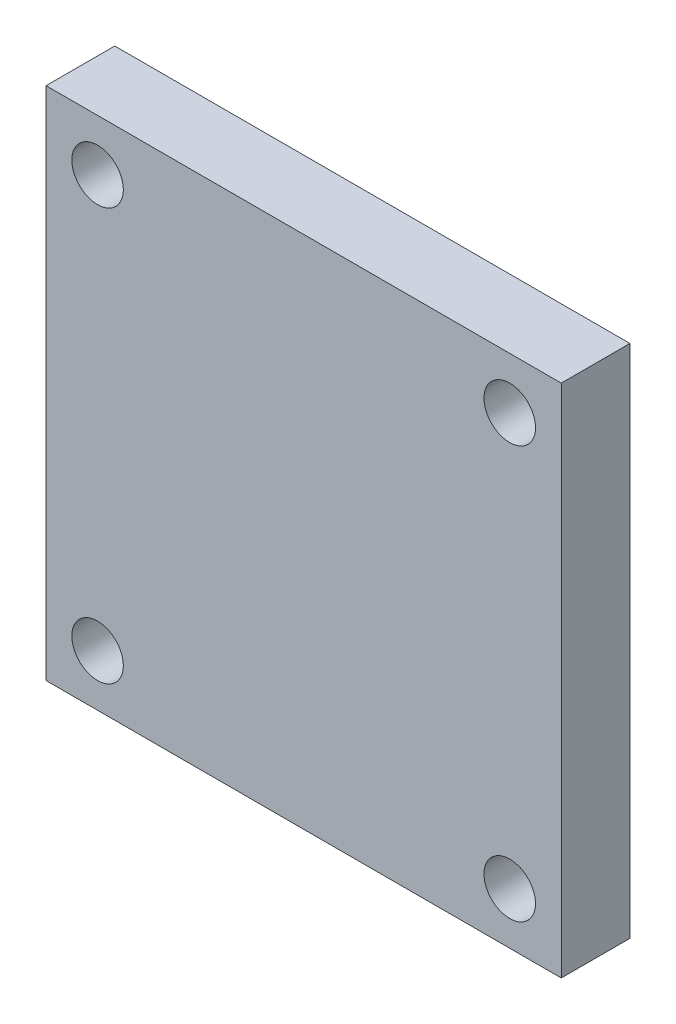
ISO-10303-21;
HEADER;
FILE_DESCRIPTION(('STEP AP214'),'2;1');
FILE_NAME('part.step','',(''),(''),'','','');
FILE_SCHEMA(('AUTOMOTIVE_DESIGN { 1 0 10303 214 1 1 1 1 }'));
ENDSEC;
DATA;
#1=APPLICATION_CONTEXT('core data for automotive mechanical design processes');
#2=APPLICATION_PROTOCOL_DEFINITION('international standard','automotive_design',2000,#1);
#3=PRODUCT_CONTEXT('',#1,'mechanical');
#4=PRODUCT('Part','Part','',(#3));
#5=PRODUCT_RELATED_PRODUCT_CATEGORY('part','',(#4));
#6=PRODUCT_DEFINITION_FORMATION('','',#4);
#7=PRODUCT_DEFINITION_CONTEXT('part definition',#1,'design');
#8=PRODUCT_DEFINITION('design','',#6,#7);
#9=PRODUCT_DEFINITION_SHAPE('','',#8);
#10=(LENGTH_UNIT() NAMED_UNIT(*) SI_UNIT(.MILLI.,.METRE.));
#11=(NAMED_UNIT(*) PLANE_ANGLE_UNIT() SI_UNIT($,.RADIAN.));
#12=(NAMED_UNIT(*) SI_UNIT($,.STERADIAN.) SOLID_ANGLE_UNIT());
#13=UNCERTAINTY_MEASURE_WITH_UNIT(LENGTH_MEASURE(1.E-05),#10,'distance_accuracy_value','');
#14=(GEOMETRIC_REPRESENTATION_CONTEXT(3) GLOBAL_UNCERTAINTY_ASSIGNED_CONTEXT((#13)) GLOBAL_UNIT_ASSIGNED_CONTEXT((#10,
#11,#12)) REPRESENTATION_CONTEXT('',''));
#15=CARTESIAN_POINT('',(0.,0.,0.));
#16=DIRECTION('',(0.,0.,1.));
#17=DIRECTION('',(1.,0.,0.));
#18=AXIS2_PLACEMENT_3D('',#15,#16,#17);
#19=CARTESIAN_POINT('',(0.,0.,4.));
#20=DIRECTION('',(0.,0.,1.));
#21=DIRECTION('',(1.,0.,0.));
#22=AXIS2_PLACEMENT_3D('',#19,#20,#21);
#23=PLANE('',#22);
#24=CARTESIAN_POINT('',(27.,-3.,4.));
#25=DIRECTION('',(0.,0.,1.));
#26=DIRECTION('',(1.,0.,0.));
#27=AXIS2_PLACEMENT_3D('',#24,#25,#26);
#28=CIRCLE('',#27,1.5);
#29=CARTESIAN_POINT('',(28.5,-3.,4.));
#30=VERTEX_POINT('',#29);
#31=EDGE_CURVE('E121',#30,#30,#28,.T.);
#32=ORIENTED_EDGE('',*,*,#31,.F.);
#33=EDGE_LOOP('',(#32));
#34=FACE_BOUND('',#33,.T.);
#35=CARTESIAN_POINT('',(3.,-3.,4.));
#36=DIRECTION('',(0.,0.,1.));
#37=DIRECTION('',(1.,0.,0.));
#38=AXIS2_PLACEMENT_3D('',#35,#36,#37);
#39=CIRCLE('',#38,1.5);
#40=CARTESIAN_POINT('',(4.50000000000001,-3.,4.));
#41=VERTEX_POINT('',#40);
#42=EDGE_CURVE('E100',#41,#41,#39,.T.);
#43=ORIENTED_EDGE('',*,*,#42,.F.);
#44=EDGE_LOOP('',(#43));
#45=FACE_BOUND('',#44,.T.);
#46=DIRECTION('',(0.,1.,0.));
#47=VECTOR('',#46,1.);
#48=CARTESIAN_POINT('',(30.,0.,4.));
#49=LINE('',#48,#47);
#50=CARTESIAN_POINT('',(30.,-30.,4.));
#51=VERTEX_POINT('',#50);
#52=CARTESIAN_POINT('',(30.,0.,4.));
#53=VERTEX_POINT('',#52);
#54=EDGE_CURVE('E85',#51,#53,#49,.T.);
#55=ORIENTED_EDGE('',*,*,#54,.T.);
#56=DIRECTION('',(-1.,0.,0.));
#57=VECTOR('',#56,1.);
#58=CARTESIAN_POINT('',(0.,0.,4.));
#59=LINE('',#58,#57);
#60=CARTESIAN_POINT('',(0.,0.,4.));
#61=VERTEX_POINT('',#60);
#62=EDGE_CURVE('E80',#53,#61,#59,.T.);
#63=ORIENTED_EDGE('',*,*,#62,.T.);
#64=DIRECTION('',(0.,-1.,0.));
#65=VECTOR('',#64,1.);
#66=CARTESIAN_POINT('',(0.,0.,4.));
#67=LINE('',#66,#65);
#68=CARTESIAN_POINT('',(0.,-30.,4.));
#69=VERTEX_POINT('',#68);
#70=EDGE_CURVE('E83',#61,#69,#67,.T.);
#71=ORIENTED_EDGE('',*,*,#70,.T.);
#72=DIRECTION('',(1.,0.,0.));
#73=VECTOR('',#72,1.);
#74=CARTESIAN_POINT('',(0.,-30.,4.));
#75=LINE('',#74,#73);
#76=EDGE_CURVE('E50',#69,#51,#75,.T.);
#77=ORIENTED_EDGE('',*,*,#76,.T.);
#78=EDGE_LOOP('',(#55,#63,#71,#77));
#79=FACE_BOUND('',#78,.T.);
#80=CARTESIAN_POINT('',(3.,-27.,4.));
#81=DIRECTION('',(0.,0.,1.));
#82=DIRECTION('',(1.,0.,0.));
#83=AXIS2_PLACEMENT_3D('',#80,#81,#82);
#84=CIRCLE('',#83,1.5);
#85=CARTESIAN_POINT('',(4.50000000000001,-27.,4.));
#86=VERTEX_POINT('',#85);
#87=EDGE_CURVE('E115',#86,#86,#84,.T.);
#88=ORIENTED_EDGE('',*,*,#87,.F.);
#89=EDGE_LOOP('',(#88));
#90=FACE_BOUND('',#89,.T.);
#91=CARTESIAN_POINT('',(27.,-27.,4.));
#92=DIRECTION('',(0.,0.,1.));
#93=DIRECTION('',(1.,0.,0.));
#94=AXIS2_PLACEMENT_3D('',#91,#92,#93);
#95=CIRCLE('',#94,1.5);
#96=CARTESIAN_POINT('',(28.5,-27.,4.));
#97=VERTEX_POINT('',#96);
#98=EDGE_CURVE('E127',#97,#97,#95,.T.);
#99=ORIENTED_EDGE('',*,*,#98,.F.);
#100=EDGE_LOOP('',(#99));
#101=FACE_BOUND('',#100,.T.);
#102=ADVANCED_FACE('F33',(#34,#45,#79,#90,#101),#23,.T.);
#103=CARTESIAN_POINT('',(0.,0.,0.));
#104=DIRECTION('',(0.,0.,1.));
#105=DIRECTION('',(1.,0.,0.));
#106=AXIS2_PLACEMENT_3D('',#103,#104,#105);
#107=PLANE('',#106);
#108=DIRECTION('',(0.,1.,0.));
#109=VECTOR('',#108,1.);
#110=CARTESIAN_POINT('',(30.,0.,0.));
#111=LINE('',#110,#109);
#112=CARTESIAN_POINT('',(30.,-30.,0.));
#113=VERTEX_POINT('',#112);
#114=CARTESIAN_POINT('',(30.,0.,0.));
#115=VERTEX_POINT('',#114);
#116=EDGE_CURVE('E97',#113,#115,#111,.T.);
#117=ORIENTED_EDGE('',*,*,#116,.F.);
#118=DIRECTION('',(1.,0.,0.));
#119=VECTOR('',#118,1.);
#120=CARTESIAN_POINT('',(0.,-30.,0.));
#121=LINE('',#120,#119);
#122=CARTESIAN_POINT('',(0.,-30.,0.));
#123=VERTEX_POINT('',#122);
#124=EDGE_CURVE('E73',#123,#113,#121,.T.);
#125=ORIENTED_EDGE('',*,*,#124,.F.);
#126=DIRECTION('',(0.,-1.,0.));
#127=VECTOR('',#126,1.);
#128=CARTESIAN_POINT('',(0.,0.,0.));
#129=LINE('',#128,#127);
#130=CARTESIAN_POINT('',(0.,0.,0.));
#131=VERTEX_POINT('',#130);
#132=EDGE_CURVE('E67',#131,#123,#129,.T.);
#133=ORIENTED_EDGE('',*,*,#132,.F.);
#134=DIRECTION('',(-1.,0.,0.));
#135=VECTOR('',#134,1.);
#136=CARTESIAN_POINT('',(0.,0.,0.));
#137=LINE('',#136,#135);
#138=EDGE_CURVE('E89',#115,#131,#137,.T.);
#139=ORIENTED_EDGE('',*,*,#138,.F.);
#140=EDGE_LOOP('',(#117,#125,#133,#139));
#141=FACE_BOUND('',#140,.T.);
#142=CARTESIAN_POINT('',(3.,-3.,0.));
#143=DIRECTION('',(0.,0.,1.));
#144=DIRECTION('',(1.,0.,0.));
#145=AXIS2_PLACEMENT_3D('',#142,#143,#144);
#146=CIRCLE('',#145,1.5);
#147=CARTESIAN_POINT('',(4.50000000000001,-3.,0.));
#148=VERTEX_POINT('',#147);
#149=EDGE_CURVE('E112',#148,#148,#146,.T.);
#150=ORIENTED_EDGE('',*,*,#149,.T.);
#151=EDGE_LOOP('',(#150));
#152=FACE_BOUND('',#151,.T.);
#153=CARTESIAN_POINT('',(3.,-27.,0.));
#154=DIRECTION('',(0.,0.,1.));
#155=DIRECTION('',(1.,0.,0.));
#156=AXIS2_PLACEMENT_3D('',#153,#154,#155);
#157=CIRCLE('',#156,1.5);
#158=CARTESIAN_POINT('',(4.50000000000001,-27.,0.));
#159=VERTEX_POINT('',#158);
#160=EDGE_CURVE('E118',#159,#159,#157,.T.);
#161=ORIENTED_EDGE('',*,*,#160,.T.);
#162=EDGE_LOOP('',(#161));
#163=FACE_BOUND('',#162,.T.);
#164=CARTESIAN_POINT('',(27.,-3.,0.));
#165=DIRECTION('',(0.,0.,1.));
#166=DIRECTION('',(1.,0.,0.));
#167=AXIS2_PLACEMENT_3D('',#164,#165,#166);
#168=CIRCLE('',#167,1.5);
#169=CARTESIAN_POINT('',(28.5,-3.,0.));
#170=VERTEX_POINT('',#169);
#171=EDGE_CURVE('E124',#170,#170,#168,.T.);
#172=ORIENTED_EDGE('',*,*,#171,.T.);
#173=EDGE_LOOP('',(#172));
#174=FACE_BOUND('',#173,.T.);
#175=CARTESIAN_POINT('',(27.,-27.,0.));
#176=DIRECTION('',(0.,0.,1.));
#177=DIRECTION('',(1.,0.,0.));
#178=AXIS2_PLACEMENT_3D('',#175,#176,#177);
#179=CIRCLE('',#178,1.5);
#180=CARTESIAN_POINT('',(28.5,-27.,0.));
#181=VERTEX_POINT('',#180);
#182=EDGE_CURVE('E130',#181,#181,#179,.T.);
#183=ORIENTED_EDGE('',*,*,#182,.T.);
#184=EDGE_LOOP('',(#183));
#185=FACE_BOUND('',#184,.T.);
#186=ADVANCED_FACE('F108',(#141,#152,#163,#174,#185),#107,.F.);
#187=CARTESIAN_POINT('',(30.,0.,4.));
#188=DIRECTION('',(-1.,0.,0.));
#189=DIRECTION('',(0.,0.,1.));
#190=AXIS2_PLACEMENT_3D('',#187,#188,#189);
#191=PLANE('',#190);
#192=ORIENTED_EDGE('',*,*,#116,.T.);
#193=DIRECTION('',(0.,0.,-1.));
#194=VECTOR('',#193,1.);
#195=CARTESIAN_POINT('',(30.,0.,4.));
#196=LINE('',#195,#194);
#197=EDGE_CURVE('E11',#53,#115,#196,.T.);
#198=ORIENTED_EDGE('',*,*,#197,.F.);
#199=ORIENTED_EDGE('',*,*,#54,.F.);
#200=DIRECTION('',(0.,0.,-1.));
#201=VECTOR('',#200,1.);
#202=CARTESIAN_POINT('',(30.,-30.,4.));
#203=LINE('',#202,#201);
#204=EDGE_CURVE('E93',#51,#113,#203,.T.);
#205=ORIENTED_EDGE('',*,*,#204,.T.);
#206=EDGE_LOOP('',(#192,#198,#199,#205));
#207=FACE_BOUND('',#206,.T.);
#208=ADVANCED_FACE('F35',(#207),#191,.F.);
#209=CARTESIAN_POINT('',(0.,0.,4.));
#210=DIRECTION('',(0.,-1.,0.));
#211=DIRECTION('',(0.,0.,-1.));
#212=AXIS2_PLACEMENT_3D('',#209,#210,#211);
#213=PLANE('',#212);
#214=ORIENTED_EDGE('',*,*,#138,.T.);
#215=DIRECTION('',(0.,0.,-1.));
#216=VECTOR('',#215,1.);
#217=CARTESIAN_POINT('',(0.,0.,4.));
#218=LINE('',#217,#216);
#219=EDGE_CURVE('E42',#61,#131,#218,.T.);
#220=ORIENTED_EDGE('',*,*,#219,.F.);
#221=ORIENTED_EDGE('',*,*,#62,.F.);
#222=ORIENTED_EDGE('',*,*,#197,.T.);
#223=EDGE_LOOP('',(#214,#220,#221,#222));
#224=FACE_BOUND('',#223,.T.);
#225=ADVANCED_FACE('F88',(#224),#213,.F.);
#226=CARTESIAN_POINT('',(0.,0.,4.));
#227=DIRECTION('',(1.,0.,0.));
#228=DIRECTION('',(0.,1.,0.));
#229=AXIS2_PLACEMENT_3D('',#226,#227,#228);
#230=PLANE('',#229);
#231=ORIENTED_EDGE('',*,*,#132,.T.);
#232=DIRECTION('',(0.,0.,-1.));
#233=VECTOR('',#232,1.);
#234=CARTESIAN_POINT('',(0.,-30.,4.));
#235=LINE('',#234,#233);
#236=EDGE_CURVE('E90',#69,#123,#235,.T.);
#237=ORIENTED_EDGE('',*,*,#236,.F.);
#238=ORIENTED_EDGE('',*,*,#70,.F.);
#239=ORIENTED_EDGE('',*,*,#219,.T.);
#240=EDGE_LOOP('',(#231,#237,#238,#239));
#241=FACE_BOUND('',#240,.T.);
#242=ADVANCED_FACE('F91',(#241),#230,.F.);
#243=CARTESIAN_POINT('',(0.,-30.,4.));
#244=DIRECTION('',(0.,1.,0.));
#245=DIRECTION('',(0.,0.,1.));
#246=AXIS2_PLACEMENT_3D('',#243,#244,#245);
#247=PLANE('',#246);
#248=ORIENTED_EDGE('',*,*,#124,.T.);
#249=ORIENTED_EDGE('',*,*,#204,.F.);
#250=ORIENTED_EDGE('',*,*,#76,.F.);
#251=ORIENTED_EDGE('',*,*,#236,.T.);
#252=EDGE_LOOP('',(#248,#249,#250,#251));
#253=FACE_BOUND('',#252,.T.);
#254=ADVANCED_FACE('F105',(#253),#247,.F.);
#255=CARTESIAN_POINT('',(3.,-3.,4.));
#256=DIRECTION('',(0.,0.,-1.));
#257=DIRECTION('',(-1.,0.,0.));
#258=AXIS2_PLACEMENT_3D('',#255,#256,#257);
#259=CYLINDRICAL_SURFACE('',#258,1.5);
#260=ORIENTED_EDGE('',*,*,#42,.T.);
#261=EDGE_LOOP('',(#260));
#262=FACE_BOUND('',#261,.T.);
#263=ORIENTED_EDGE('',*,*,#149,.F.);
#264=EDGE_LOOP('',(#263));
#265=FACE_BOUND('',#264,.T.);
#266=ADVANCED_FACE('F149',(#262,#265),#259,.F.);
#267=CARTESIAN_POINT('',(3.,-27.,4.));
#268=DIRECTION('',(0.,0.,-1.));
#269=DIRECTION('',(-1.,0.,0.));
#270=AXIS2_PLACEMENT_3D('',#267,#268,#269);
#271=CYLINDRICAL_SURFACE('',#270,1.5);
#272=ORIENTED_EDGE('',*,*,#87,.T.);
#273=EDGE_LOOP('',(#272));
#274=FACE_BOUND('',#273,.T.);
#275=ORIENTED_EDGE('',*,*,#160,.F.);
#276=EDGE_LOOP('',(#275));
#277=FACE_BOUND('',#276,.T.);
#278=ADVANCED_FACE('F195',(#274,#277),#271,.F.);
#279=CARTESIAN_POINT('',(27.,-3.,4.));
#280=DIRECTION('',(0.,0.,-1.));
#281=DIRECTION('',(-1.,0.,0.));
#282=AXIS2_PLACEMENT_3D('',#279,#280,#281);
#283=CYLINDRICAL_SURFACE('',#282,1.5);
#284=ORIENTED_EDGE('',*,*,#31,.T.);
#285=EDGE_LOOP('',(#284));
#286=FACE_BOUND('',#285,.T.);
#287=ORIENTED_EDGE('',*,*,#171,.F.);
#288=EDGE_LOOP('',(#287));
#289=FACE_BOUND('',#288,.T.);
#290=ADVANCED_FACE('F203',(#286,#289),#283,.F.);
#291=CARTESIAN_POINT('',(27.,-27.,4.));
#292=DIRECTION('',(0.,0.,-1.));
#293=DIRECTION('',(-1.,0.,0.));
#294=AXIS2_PLACEMENT_3D('',#291,#292,#293);
#295=CYLINDRICAL_SURFACE('',#294,1.5);
#296=ORIENTED_EDGE('',*,*,#98,.T.);
#297=EDGE_LOOP('',(#296));
#298=FACE_BOUND('',#297,.T.);
#299=ORIENTED_EDGE('',*,*,#182,.F.);
#300=EDGE_LOOP('',(#299));
#301=FACE_BOUND('',#300,.T.);
#302=ADVANCED_FACE('F136',(#298,#301),#295,.F.);
#303=CLOSED_SHELL('',(#102,#186,#208,#225,#242,#254,#266,#278,#290,#302));
#304=MANIFOLD_SOLID_BREP('B2',#303);
#305=ADVANCED_BREP_SHAPE_REPRESENTATION('',(#18,#304),#14);
#306=SHAPE_DEFINITION_REPRESENTATION(#9,#305);
ENDSEC;
END-ISO-10303-21;
